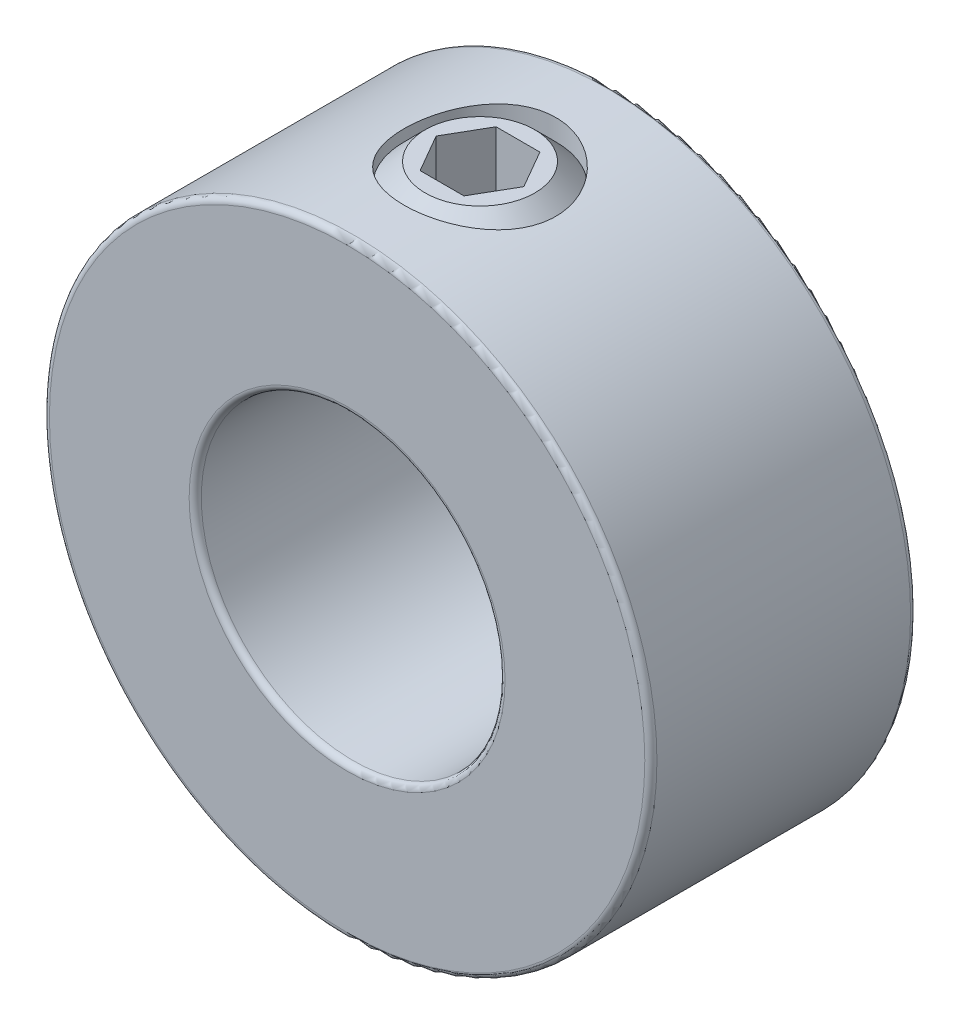
ISO-10303-21;
HEADER;
FILE_DESCRIPTION(('STEP AP214'),'2;1');
FILE_NAME('part.step','',(''),(''),'','','');
FILE_SCHEMA(('AUTOMOTIVE_DESIGN { 1 0 10303 214 1 1 1 1 }'));
ENDSEC;
DATA;
#1=APPLICATION_CONTEXT('core data for automotive mechanical design processes');
#2=APPLICATION_PROTOCOL_DEFINITION('international standard','automotive_design',2000,#1);
#3=PRODUCT_CONTEXT('',#1,'mechanical');
#4=PRODUCT('Part','Part','',(#3));
#5=PRODUCT_RELATED_PRODUCT_CATEGORY('part','',(#4));
#6=PRODUCT_DEFINITION_FORMATION('','',#4);
#7=PRODUCT_DEFINITION_CONTEXT('part definition',#1,'design');
#8=PRODUCT_DEFINITION('design','',#6,#7);
#9=PRODUCT_DEFINITION_SHAPE('','',#8);
#10=(LENGTH_UNIT() NAMED_UNIT(*) SI_UNIT(.MILLI.,.METRE.));
#11=(NAMED_UNIT(*) PLANE_ANGLE_UNIT() SI_UNIT($,.RADIAN.));
#12=(NAMED_UNIT(*) SI_UNIT($,.STERADIAN.) SOLID_ANGLE_UNIT());
#13=UNCERTAINTY_MEASURE_WITH_UNIT(LENGTH_MEASURE(1.E-05),#10,'distance_accuracy_value','');
#14=(GEOMETRIC_REPRESENTATION_CONTEXT(3) GLOBAL_UNCERTAINTY_ASSIGNED_CONTEXT((#13)) GLOBAL_UNIT_ASSIGNED_CONTEXT((#10,
#11,#12)) REPRESENTATION_CONTEXT('',''));
#15=CARTESIAN_POINT('',(0.,0.,0.));
#16=DIRECTION('',(0.,0.,1.));
#17=DIRECTION('',(1.,0.,0.));
#18=AXIS2_PLACEMENT_3D('',#15,#16,#17);
#19=CARTESIAN_POINT('',(0.,7.23364111915365,5.55625));
#20=DIRECTION('',(0.,1.,0.));
#21=DIRECTION('',(-1.,0.,0.));
#22=AXIS2_PLACEMENT_3D('',#19,#20,#21);
#23=CONICAL_SURFACE('',#22,3.175,0.785398163397439);
#24=CARTESIAN_POINT('',(0.,6.35,5.55625));
#25=DIRECTION('',(0.,-1.,0.));
#26=DIRECTION('',(1.,0.,0.));
#27=AXIS2_PLACEMENT_3D('',#24,#25,#26);
#28=CIRCLE('',#27,2.29135888084637);
#29=CARTESIAN_POINT('',(2.29135888084637,6.35,5.55625));
#30=VERTEX_POINT('',#29);
#31=EDGE_CURVE('E12',#30,#30,#28,.T.);
#32=ORIENTED_EDGE('',*,*,#31,.F.);
#33=EDGE_LOOP('',(#32));
#34=FACE_BOUND('',#33,.T.);
#35=CARTESIAN_POINT('',(0.,7.23364111915365,5.55625));
#36=DIRECTION('',(0.,-1.,0.));
#37=DIRECTION('',(1.,0.,0.));
#38=AXIS2_PLACEMENT_3D('',#35,#36,#37);
#39=CIRCLE('',#38,3.175);
#40=CARTESIAN_POINT('',(3.175,7.23364111915365,5.55625));
#41=VERTEX_POINT('',#40);
#42=EDGE_CURVE('E141',#41,#41,#39,.T.);
#43=ORIENTED_EDGE('',*,*,#42,.T.);
#44=EDGE_LOOP('',(#43));
#45=FACE_BOUND('',#44,.T.);
#46=ADVANCED_FACE('F42',(#34,#45),#23,.T.);
#47=CARTESIAN_POINT('',(-0.79375,6.35,5.55625));
#48=DIRECTION('',(0.,1.,0.));
#49=DIRECTION('',(-1.,0.,0.));
#50=AXIS2_PLACEMENT_3D('',#47,#48,#49);
#51=PLANE('',#50);
#52=CARTESIAN_POINT('',(0.,6.35,5.55625));
#53=DIRECTION('',(0.,-1.,0.));
#54=DIRECTION('',(1.,0.,0.));
#55=AXIS2_PLACEMENT_3D('',#52,#53,#54);
#56=CIRCLE('',#55,0.79375);
#57=CARTESIAN_POINT('',(0.79375,6.35,5.55625));
#58=VERTEX_POINT('',#57);
#59=EDGE_CURVE('E49',#58,#58,#56,.T.);
#60=ORIENTED_EDGE('',*,*,#59,.F.);
#61=EDGE_LOOP('',(#60));
#62=FACE_BOUND('',#61,.T.);
#63=ORIENTED_EDGE('',*,*,#31,.T.);
#64=EDGE_LOOP('',(#63));
#65=FACE_BOUND('',#64,.T.);
#66=ADVANCED_FACE('F161',(#62,#65),#51,.F.);
#67=CARTESIAN_POINT('',(0.,6.35,5.55625));
#68=DIRECTION('',(0.,-1.,0.));
#69=DIRECTION('',(1.,0.,0.));
#70=AXIS2_PLACEMENT_3D('',#67,#68,#69);
#71=CONICAL_SURFACE('',#70,0.79375,0.523598775598296);
#72=CARTESIAN_POINT('',(0.,7.72481532850781,5.55625));
#73=VERTEX_POINT('',#72);
#74=VERTEX_LOOP('',#73);
#75=FACE_BOUND('',#74,.T.);
#76=ORIENTED_EDGE('',*,*,#59,.T.);
#77=EDGE_LOOP('',(#76));
#78=FACE_BOUND('',#77,.T.);
#79=ADVANCED_FACE('F159',(#75,#78),#71,.F.);
#80=CARTESIAN_POINT('',(0.,12.7,5.55625));
#81=DIRECTION('',(0.,-1.,0.));
#82=DIRECTION('',(1.,0.,0.));
#83=AXIS2_PLACEMENT_3D('',#80,#81,#82);
#84=PLANE('',#83);
#85=DIRECTION('',(0.5,0.,0.866025403784438));
#86=VECTOR('',#85,1.);
#87=CARTESIAN_POINT('',(-1.83308710467713,12.7,5.55625000000001));
#88=LINE('',#87,#86);
#89=CARTESIAN_POINT('',(-1.83308710467713,12.7,5.55625000000001));
#90=VERTEX_POINT('',#89);
#91=CARTESIAN_POINT('',(-0.916543552338603,12.7,7.14375));
#92=VERTEX_POINT('',#91);
#93=EDGE_CURVE('E129',#90,#92,#88,.T.);
#94=ORIENTED_EDGE('',*,*,#93,.F.);
#95=DIRECTION('',(-0.499999999999999,0.,0.866025403784439));
#96=VECTOR('',#95,1.);
#97=CARTESIAN_POINT('',(-0.916543552338605,12.7,3.96875));
#98=LINE('',#97,#96);
#99=CARTESIAN_POINT('',(-0.916543552338605,12.7,3.96875));
#100=VERTEX_POINT('',#99);
#101=EDGE_CURVE('E56',#100,#90,#98,.T.);
#102=ORIENTED_EDGE('',*,*,#101,.F.);
#103=DIRECTION('',(-1.,0.,0.));
#104=VECTOR('',#103,1.);
#105=CARTESIAN_POINT('',(0.916543552338457,12.7,3.96875));
#106=LINE('',#105,#104);
#107=CARTESIAN_POINT('',(0.916543552338457,12.7,3.96875));
#108=VERTEX_POINT('',#107);
#109=EDGE_CURVE('E115',#108,#100,#106,.T.);
#110=ORIENTED_EDGE('',*,*,#109,.F.);
#111=DIRECTION('',(-0.5,0.,-0.866025403784438));
#112=VECTOR('',#111,1.);
#113=CARTESIAN_POINT('',(1.83308710467699,12.7,5.55625));
#114=LINE('',#113,#112);
#115=CARTESIAN_POINT('',(1.83308710467699,12.7,5.55625));
#116=VERTEX_POINT('',#115);
#117=EDGE_CURVE('E118',#116,#108,#114,.T.);
#118=ORIENTED_EDGE('',*,*,#117,.F.);
#119=DIRECTION('',(0.499999999999999,0.,-0.866025403784439));
#120=VECTOR('',#119,1.);
#121=CARTESIAN_POINT('',(0.916543552338459,12.7,7.14375));
#122=LINE('',#121,#120);
#123=CARTESIAN_POINT('',(0.916543552338459,12.7,7.14375));
#124=VERTEX_POINT('',#123);
#125=EDGE_CURVE('E134',#124,#116,#122,.T.);
#126=ORIENTED_EDGE('',*,*,#125,.F.);
#127=DIRECTION('',(1.,0.,0.));
#128=VECTOR('',#127,1.);
#129=CARTESIAN_POINT('',(-0.916543552338603,12.7,7.14375));
#130=LINE('',#129,#128);
#131=EDGE_CURVE('E131',#92,#124,#130,.T.);
#132=ORIENTED_EDGE('',*,*,#131,.F.);
#133=EDGE_LOOP('',(#94,#102,#110,#118,#126,#132));
#134=FACE_BOUND('',#133,.T.);
#135=CARTESIAN_POINT('',(0.,12.7,5.55625));
#136=DIRECTION('',(0.,-1.,0.));
#137=DIRECTION('',(1.,0.,0.));
#138=AXIS2_PLACEMENT_3D('',#135,#136,#137);
#139=CIRCLE('',#138,2.29135888084637);
#140=CARTESIAN_POINT('',(2.29135888084637,12.7,5.55625));
#141=VERTEX_POINT('',#140);
#142=EDGE_CURVE('E154',#141,#141,#139,.T.);
#143=ORIENTED_EDGE('',*,*,#142,.F.);
#144=EDGE_LOOP('',(#143));
#145=FACE_BOUND('',#144,.T.);
#146=ADVANCED_FACE('F179',(#134,#145),#84,.F.);
#147=CARTESIAN_POINT('',(0.,12.7,5.55625));
#148=DIRECTION('',(0.,-1.,0.));
#149=DIRECTION('',(1.,0.,0.));
#150=AXIS2_PLACEMENT_3D('',#147,#148,#149);
#151=CONICAL_SURFACE('',#150,2.29135888084637,0.785398163397431);
#152=CARTESIAN_POINT('',(0.,11.8163588808463,5.55625));
#153=DIRECTION('',(0.,-1.,0.));
#154=DIRECTION('',(1.,0.,0.));
#155=AXIS2_PLACEMENT_3D('',#152,#153,#154);
#156=CIRCLE('',#155,3.175);
#157=CARTESIAN_POINT('',(3.175,11.8163588808463,5.55625));
#158=VERTEX_POINT('',#157);
#159=EDGE_CURVE('E151',#158,#158,#156,.T.);
#160=ORIENTED_EDGE('',*,*,#159,.F.);
#161=EDGE_LOOP('',(#160));
#162=FACE_BOUND('',#161,.T.);
#163=ORIENTED_EDGE('',*,*,#142,.T.);
#164=EDGE_LOOP('',(#163));
#165=FACE_BOUND('',#164,.T.);
#166=ADVANCED_FACE('F173',(#162,#165),#151,.T.);
#167=CARTESIAN_POINT('',(0.,7.72481532850781,5.55625));
#168=DIRECTION('',(0.,-1.,0.));
#169=DIRECTION('',(1.,0.,0.));
#170=AXIS2_PLACEMENT_3D('',#167,#168,#169);
#171=CYLINDRICAL_SURFACE('',#170,3.175);
#172=ORIENTED_EDGE('',*,*,#42,.F.);
#173=EDGE_LOOP('',(#172));
#174=FACE_BOUND('',#173,.T.);
#175=ORIENTED_EDGE('',*,*,#159,.T.);
#176=EDGE_LOOP('',(#175));
#177=FACE_BOUND('',#176,.T.);
#178=ADVANCED_FACE('F170',(#174,#177),#171,.T.);
#179=CARTESIAN_POINT('',(-0.916543552338604,10.16,3.96875));
#180=DIRECTION('',(-0.866025403784439,0.,-0.499999999999999));
#181=DIRECTION('',(-0.499999999999999,0.,0.866025403784439));
#182=AXIS2_PLACEMENT_3D('',#179,#180,#181);
#183=PLANE('',#182);
#184=ORIENTED_EDGE('',*,*,#101,.T.);
#185=DIRECTION('',(0.,1.,0.));
#186=VECTOR('',#185,1.);
#187=CARTESIAN_POINT('',(-1.83308710467713,10.16,5.55625000000001));
#188=LINE('',#187,#186);
#189=CARTESIAN_POINT('',(-1.83308710467713,10.16,5.55625000000001));
#190=VERTEX_POINT('',#189);
#191=EDGE_CURVE('E92',#190,#90,#188,.T.);
#192=ORIENTED_EDGE('',*,*,#191,.F.);
#193=DIRECTION('',(-0.499999999999999,0.,0.866025403784439));
#194=VECTOR('',#193,1.);
#195=CARTESIAN_POINT('',(-0.916543552338604,10.16,3.96875));
#196=LINE('',#195,#194);
#197=CARTESIAN_POINT('',(-0.916543552338604,10.16,3.96875));
#198=VERTEX_POINT('',#197);
#199=EDGE_CURVE('E96',#198,#190,#196,.T.);
#200=ORIENTED_EDGE('',*,*,#199,.F.);
#201=DIRECTION('',(0.,1.,0.));
#202=VECTOR('',#201,1.);
#203=CARTESIAN_POINT('',(-0.916543552338604,10.16,3.96875));
#204=LINE('',#203,#202);
#205=EDGE_CURVE('E139',#198,#100,#204,.T.);
#206=ORIENTED_EDGE('',*,*,#205,.T.);
#207=EDGE_LOOP('',(#184,#192,#200,#206));
#208=FACE_BOUND('',#207,.T.);
#209=ADVANCED_FACE('F94',(#208),#183,.F.);
#210=CARTESIAN_POINT('',(0.916543552338458,10.16,3.96875));
#211=DIRECTION('',(0.,0.,-1.));
#212=DIRECTION('',(-1.,0.,0.));
#213=AXIS2_PLACEMENT_3D('',#210,#211,#212);
#214=PLANE('',#213);
#215=ORIENTED_EDGE('',*,*,#109,.T.);
#216=ORIENTED_EDGE('',*,*,#205,.F.);
#217=DIRECTION('',(-1.,0.,0.));
#218=VECTOR('',#217,1.);
#219=CARTESIAN_POINT('',(0.916543552338458,10.16,3.96875));
#220=LINE('',#219,#218);
#221=CARTESIAN_POINT('',(0.916543552338458,10.16,3.96875));
#222=VERTEX_POINT('',#221);
#223=EDGE_CURVE('E102',#222,#198,#220,.T.);
#224=ORIENTED_EDGE('',*,*,#223,.F.);
#225=DIRECTION('',(0.,1.,0.));
#226=VECTOR('',#225,1.);
#227=CARTESIAN_POINT('',(0.916543552338458,10.16,3.96875));
#228=LINE('',#227,#226);
#229=EDGE_CURVE('E142',#222,#108,#228,.T.);
#230=ORIENTED_EDGE('',*,*,#229,.T.);
#231=EDGE_LOOP('',(#215,#216,#224,#230));
#232=FACE_BOUND('',#231,.T.);
#233=ADVANCED_FACE('F193',(#232),#214,.F.);
#234=CARTESIAN_POINT('',(1.83308710467699,10.16,5.55625));
#235=DIRECTION('',(0.866025403784438,0.,-0.5));
#236=DIRECTION('',(-0.5,0.,-0.866025403784438));
#237=AXIS2_PLACEMENT_3D('',#234,#235,#236);
#238=PLANE('',#237);
#239=ORIENTED_EDGE('',*,*,#117,.T.);
#240=ORIENTED_EDGE('',*,*,#229,.F.);
#241=DIRECTION('',(-0.5,0.,-0.866025403784438));
#242=VECTOR('',#241,1.);
#243=CARTESIAN_POINT('',(1.83308710467699,10.16,5.55625));
#244=LINE('',#243,#242);
#245=CARTESIAN_POINT('',(1.83308710467699,10.16,5.55625));
#246=VERTEX_POINT('',#245);
#247=EDGE_CURVE('E125',#246,#222,#244,.T.);
#248=ORIENTED_EDGE('',*,*,#247,.F.);
#249=DIRECTION('',(0.,1.,0.));
#250=VECTOR('',#249,1.);
#251=CARTESIAN_POINT('',(1.83308710467699,10.16,5.55625));
#252=LINE('',#251,#250);
#253=EDGE_CURVE('E144',#246,#116,#252,.T.);
#254=ORIENTED_EDGE('',*,*,#253,.T.);
#255=EDGE_LOOP('',(#239,#240,#248,#254));
#256=FACE_BOUND('',#255,.T.);
#257=ADVANCED_FACE('F203',(#256),#238,.F.);
#258=CARTESIAN_POINT('',(0.916543552338459,10.16,7.14375));
#259=DIRECTION('',(0.866025403784439,0.,0.499999999999999));
#260=DIRECTION('',(0.499999999999999,0.,-0.866025403784439));
#261=AXIS2_PLACEMENT_3D('',#258,#259,#260);
#262=PLANE('',#261);
#263=ORIENTED_EDGE('',*,*,#125,.T.);
#264=ORIENTED_EDGE('',*,*,#253,.F.);
#265=DIRECTION('',(0.499999999999999,0.,-0.866025403784439));
#266=VECTOR('',#265,1.);
#267=CARTESIAN_POINT('',(0.916543552338459,10.16,7.14375));
#268=LINE('',#267,#266);
#269=CARTESIAN_POINT('',(0.916543552338459,10.16,7.14375));
#270=VERTEX_POINT('',#269);
#271=EDGE_CURVE('E122',#270,#246,#268,.T.);
#272=ORIENTED_EDGE('',*,*,#271,.F.);
#273=DIRECTION('',(0.,1.,0.));
#274=VECTOR('',#273,1.);
#275=CARTESIAN_POINT('',(0.916543552338459,10.16,7.14375));
#276=LINE('',#275,#274);
#277=EDGE_CURVE('E146',#270,#124,#276,.T.);
#278=ORIENTED_EDGE('',*,*,#277,.T.);
#279=EDGE_LOOP('',(#263,#264,#272,#278));
#280=FACE_BOUND('',#279,.T.);
#281=ADVANCED_FACE('F199',(#280),#262,.F.);
#282=CARTESIAN_POINT('',(-0.916543552338603,10.16,7.14375));
#283=DIRECTION('',(0.,0.,1.));
#284=DIRECTION('',(1.,0.,0.));
#285=AXIS2_PLACEMENT_3D('',#282,#283,#284);
#286=PLANE('',#285);
#287=ORIENTED_EDGE('',*,*,#131,.T.);
#288=ORIENTED_EDGE('',*,*,#277,.F.);
#289=DIRECTION('',(1.,0.,0.));
#290=VECTOR('',#289,1.);
#291=CARTESIAN_POINT('',(-0.916543552338603,10.16,7.14375));
#292=LINE('',#291,#290);
#293=CARTESIAN_POINT('',(-0.916543552338603,10.16,7.14375));
#294=VERTEX_POINT('',#293);
#295=EDGE_CURVE('E110',#294,#270,#292,.T.);
#296=ORIENTED_EDGE('',*,*,#295,.F.);
#297=DIRECTION('',(0.,1.,0.));
#298=VECTOR('',#297,1.);
#299=CARTESIAN_POINT('',(-0.916543552338603,10.16,7.14375));
#300=LINE('',#299,#298);
#301=EDGE_CURVE('E101',#294,#92,#300,.T.);
#302=ORIENTED_EDGE('',*,*,#301,.T.);
#303=EDGE_LOOP('',(#287,#288,#296,#302));
#304=FACE_BOUND('',#303,.T.);
#305=ADVANCED_FACE('F196',(#304),#286,.F.);
#306=CARTESIAN_POINT('',(-1.83308710467713,10.16,5.55625000000001));
#307=DIRECTION('',(-0.866025403784438,0.,0.5));
#308=DIRECTION('',(0.5,0.,0.866025403784439));
#309=AXIS2_PLACEMENT_3D('',#306,#307,#308);
#310=PLANE('',#309);
#311=ORIENTED_EDGE('',*,*,#93,.T.);
#312=ORIENTED_EDGE('',*,*,#301,.F.);
#313=DIRECTION('',(0.5,0.,0.866025403784438));
#314=VECTOR('',#313,1.);
#315=CARTESIAN_POINT('',(-1.83308710467713,10.16,5.55625000000001));
#316=LINE('',#315,#314);
#317=EDGE_CURVE('E105',#190,#294,#316,.T.);
#318=ORIENTED_EDGE('',*,*,#317,.F.);
#319=ORIENTED_EDGE('',*,*,#191,.T.);
#320=EDGE_LOOP('',(#311,#312,#318,#319));
#321=FACE_BOUND('',#320,.T.);
#322=ADVANCED_FACE('F106',(#321),#310,.F.);
#323=CARTESIAN_POINT('',(-2.74963065701566,10.16,7.14375));
#324=DIRECTION('',(0.,1.,0.));
#325=DIRECTION('',(0.,0.,1.));
#326=AXIS2_PLACEMENT_3D('',#323,#324,#325);
#327=PLANE('',#326);
#328=ORIENTED_EDGE('',*,*,#199,.T.);
#329=ORIENTED_EDGE('',*,*,#317,.T.);
#330=ORIENTED_EDGE('',*,*,#295,.T.);
#331=ORIENTED_EDGE('',*,*,#271,.T.);
#332=ORIENTED_EDGE('',*,*,#247,.T.);
#333=ORIENTED_EDGE('',*,*,#223,.T.);
#334=EDGE_LOOP('',(#328,#329,#330,#331,#332,#333));
#335=FACE_BOUND('',#334,.T.);
#336=ADVANCED_FACE('F112',(#335),#327,.T.);
#337=CLOSED_SHELL('',(#46,#66,#79,#146,#166,#178,#209,#233,#257,#281,#305,#322,#336));
#338=MANIFOLD_SOLID_BREP('B2',#337);
#339=CARTESIAN_POINT('',(0.,0.,11.1125));
#340=DIRECTION('',(0.,0.,1.));
#341=DIRECTION('',(1.,0.,0.));
#342=AXIS2_PLACEMENT_3D('',#339,#340,#341);
#343=PLANE('',#342);
#344=CARTESIAN_POINT('',(0.,0.,11.1125));
#345=DIRECTION('',(0.,0.,1.));
#346=DIRECTION('',(1.,0.,0.));
#347=AXIS2_PLACEMENT_3D('',#344,#345,#346);
#348=CIRCLE('',#347,6.604);
#349=CARTESIAN_POINT('',(6.604,0.,11.1125));
#350=VERTEX_POINT('',#349);
#351=EDGE_CURVE('E307',#350,#350,#348,.F.);
#352=ORIENTED_EDGE('',*,*,#351,.T.);
#353=EDGE_LOOP('',(#352));
#354=FACE_BOUND('',#353,.T.);
#355=CARTESIAN_POINT('',(0.,0.,11.1125));
#356=DIRECTION('',(0.,0.,1.));
#357=DIRECTION('',(1.,0.,0.));
#358=AXIS2_PLACEMENT_3D('',#355,#356,#357);
#359=CIRCLE('',#358,12.446);
#360=CARTESIAN_POINT('',(12.446,0.,11.1125));
#361=VERTEX_POINT('',#360);
#362=EDGE_CURVE('E311',#361,#361,#359,.T.);
#363=ORIENTED_EDGE('',*,*,#362,.T.);
#364=EDGE_LOOP('',(#363));
#365=FACE_BOUND('',#364,.T.);
#366=ADVANCED_FACE('F296',(#354,#365),#343,.T.);
#367=CARTESIAN_POINT('',(0.,0.,0.));
#368=DIRECTION('',(0.,0.,1.));
#369=DIRECTION('',(1.,0.,0.));
#370=AXIS2_PLACEMENT_3D('',#367,#368,#369);
#371=PLANE('',#370);
#372=CARTESIAN_POINT('',(0.,0.,0.));
#373=DIRECTION('',(0.,0.,1.));
#374=DIRECTION('',(1.,0.,0.));
#375=AXIS2_PLACEMENT_3D('',#372,#373,#374);
#376=CIRCLE('',#375,6.604);
#377=CARTESIAN_POINT('',(6.604,0.,0.));
#378=VERTEX_POINT('',#377);
#379=EDGE_CURVE('E322',#378,#378,#376,.T.);
#380=ORIENTED_EDGE('',*,*,#379,.T.);
#381=EDGE_LOOP('',(#380));
#382=FACE_BOUND('',#381,.T.);
#383=CARTESIAN_POINT('',(0.,0.,0.));
#384=DIRECTION('',(0.,0.,1.));
#385=DIRECTION('',(1.,0.,0.));
#386=AXIS2_PLACEMENT_3D('',#383,#384,#385);
#387=CIRCLE('',#386,12.446);
#388=CARTESIAN_POINT('',(12.446,0.,0.));
#389=VERTEX_POINT('',#388);
#390=EDGE_CURVE('E325',#389,#389,#387,.F.);
#391=ORIENTED_EDGE('',*,*,#390,.T.);
#392=EDGE_LOOP('',(#391));
#393=FACE_BOUND('',#392,.T.);
#394=ADVANCED_FACE('F359',(#382,#393),#371,.F.);
#395=CARTESIAN_POINT('',(0.,0.,11.1125));
#396=DIRECTION('',(0.,0.,-1.));
#397=DIRECTION('',(-1.,0.,0.));
#398=AXIS2_PLACEMENT_3D('',#395,#396,#397);
#399=CYLINDRICAL_SURFACE('',#398,12.7);
#400=CARTESIAN_POINT('',(0.,0.,0.254000000000001));
#401=DIRECTION('',(0.,0.,1.));
#402=DIRECTION('',(1.,0.,0.));
#403=AXIS2_PLACEMENT_3D('',#400,#401,#402);
#404=CIRCLE('',#403,12.7);
#405=CARTESIAN_POINT('',(12.7,0.,0.254000000000001));
#406=VERTEX_POINT('',#405);
#407=EDGE_CURVE('E41',#406,#406,#404,.T.);
#408=ORIENTED_EDGE('',*,*,#407,.T.);
#409=EDGE_LOOP('',(#408));
#410=FACE_BOUND('',#409,.T.);
#411=CARTESIAN_POINT('',(0.,0.,10.8585));
#412=DIRECTION('',(0.,0.,1.));
#413=DIRECTION('',(1.,0.,0.));
#414=AXIS2_PLACEMENT_3D('',#411,#412,#413);
#415=CIRCLE('',#414,12.7);
#416=CARTESIAN_POINT('',(12.7,0.,10.8585));
#417=VERTEX_POINT('',#416);
#418=EDGE_CURVE('E303',#417,#417,#415,.F.);
#419=ORIENTED_EDGE('',*,*,#418,.T.);
#420=EDGE_LOOP('',(#419));
#421=FACE_BOUND('',#420,.T.);
#422=CARTESIAN_POINT('',(0.,12.7,8.73125));
#423=CARTESIAN_POINT('',(-0.175421054350931,12.6999970338729,8.73124507718757));
#424=CARTESIAN_POINT('',(-0.350897100741782,12.6963292371237,8.71666288419548));
#425=CARTESIAN_POINT('',(-0.696820051980961,12.6820530760661,8.65880676306684));
#426=CARTESIAN_POINT('',(-0.867264049209732,12.6714407780562,8.61551657314489));
#427=CARTESIAN_POINT('',(-1.19807751278645,12.6444507573614,8.50172024683859));
#428=CARTESIAN_POINT('',(-1.35845880926017,12.6280799601569,8.43124679271935));
#429=CARTESIAN_POINT('',(-1.6651226791977,12.591316443928,8.26519939107175));
#430=CARTESIAN_POINT('',(-1.81140477687155,12.5709235892463,8.16962459688152));
#431=CARTESIAN_POINT('',(-2.08873074612027,12.5278602543575,7.95400832856532));
#432=CARTESIAN_POINT('',(-2.2194428772959,12.5051546346353,7.83354716633666));
#433=CARTESIAN_POINT('',(-2.45903522924703,12.4602582924963,7.57247616627588));
#434=CARTESIAN_POINT('',(-2.56791298487579,12.4380676284689,7.43186405642899));
#435=CARTESIAN_POINT('',(-2.76230618225783,12.3963594189446,7.13190677007337));
#436=CARTESIAN_POINT('',(-2.84745052370821,12.3768864828385,6.97231432812153));
#437=CARTESIAN_POINT('',(-2.98957345643241,12.343330973648,6.64051586198626));
#438=CARTESIAN_POINT('',(-3.04655655068163,12.3292475388652,6.46831185944724));
#439=CARTESIAN_POINT('',(-3.12960773790342,12.3084267567388,6.11982626213982));
#440=CARTESIAN_POINT('',(-3.15627230130285,12.3015478927701,5.94369547005292));
#441=CARTESIAN_POINT('',(-3.17978742389056,12.2954915053947,5.58933652895139));
#442=CARTESIAN_POINT('',(-3.176642833515,12.2963127290578,5.41110872586831));
#443=CARTESIAN_POINT('',(-3.14110481048737,12.3054365167726,5.06218654027234));
#444=CARTESIAN_POINT('',(-3.10942215340351,12.3135572669877,4.89141426789839));
#445=CARTESIAN_POINT('',(-3.01884119561133,12.3360753547043,4.55768910890493));
#446=CARTESIAN_POINT('',(-2.95994095604688,12.3504731393489,4.39473678025545));
#447=CARTESIAN_POINT('',(-2.81599106163371,12.3840899110031,4.079371198933));
#448=CARTESIAN_POINT('',(-2.73068344564301,12.4033560981111,3.92708093637875));
#449=CARTESIAN_POINT('',(-2.53652078423163,12.4445122129068,3.63872206434807));
#450=CARTESIAN_POINT('',(-2.42766161831204,12.4664025994163,3.50265629992432));
#451=CARTESIAN_POINT('',(-2.18580424890858,12.5111061380944,3.24653568011351));
#452=CARTESIAN_POINT('',(-2.05220624645107,12.533927803951,3.12704799603681));
#453=CARTESIAN_POINT('',(-1.76659522538283,12.5773596047503,2.91206503678474));
#454=CARTESIAN_POINT('',(-1.61458164448181,12.5979696721291,2.81657049447546));
#455=CARTESIAN_POINT('',(-1.29564529770894,12.6347586626604,2.65207625915839));
#456=CARTESIAN_POINT('',(-1.12867311562492,12.6509221227036,2.58316869646146));
#457=CARTESIAN_POINT('',(-0.785020883902434,12.676884242985,2.47455836958141));
#458=CARTESIAN_POINT('',(-0.608342698201858,12.6866841206814,2.43485001891495));
#459=CARTESIAN_POINT('',(-0.255142937325555,12.6986347345774,2.3866314862338));
#460=CARTESIAN_POINT('',(-0.0787330573083763,12.7009747992585,2.37734892814061));
#461=CARTESIAN_POINT('',(0.273119584996528,12.6982813685726,2.38812705435079));
#462=CARTESIAN_POINT('',(0.448562432914396,12.6932485369526,2.40818509725818));
#463=CARTESIAN_POINT('',(0.79081686891024,12.6764961338623,2.47643842276175));
#464=CARTESIAN_POINT('',(0.957717835150523,12.6648767569325,2.52421234102626));
#465=CARTESIAN_POINT('',(1.28112793569116,12.6362609570897,2.64605999452691));
#466=CARTESIAN_POINT('',(1.43763601861911,12.6192639911647,2.72013638579632));
#467=CARTESIAN_POINT('',(1.73889063454314,12.5813250177716,2.8939831394514));
#468=CARTESIAN_POINT('',(1.88337918521904,12.5603183592593,2.99418610457274));
#469=CARTESIAN_POINT('',(2.15376466554501,12.5167921111412,3.21688864028734));
#470=CARTESIAN_POINT('',(2.27965837982672,12.4942722608556,3.33939205885733));
#471=CARTESIAN_POINT('',(2.51246336908675,12.4495762556412,3.60680415045255));
#472=CARTESIAN_POINT('',(2.6188328531313,12.4274221051899,3.75218897134919));
#473=CARTESIAN_POINT('',(2.80566443991221,12.3865825924258,4.05920074295838));
#474=CARTESIAN_POINT('',(2.88612769264178,12.3678970761538,4.22082697228701));
#475=CARTESIAN_POINT('',(3.0182638402854,12.3363163381503,4.55486711242697));
#476=CARTESIAN_POINT('',(3.07010730622843,12.3233869021911,4.72721014659598));
#477=CARTESIAN_POINT('',(3.14398164687971,12.3047494152553,5.07853873345877));
#478=CARTESIAN_POINT('',(3.16601904149253,12.299039785006,5.25752282465607));
#479=CARTESIAN_POINT('',(3.17931501621074,12.2956087422145,5.61153950052041));
#480=CARTESIAN_POINT('',(3.17143955029538,12.2976625750886,5.7865379043875));
#481=CARTESIAN_POINT('',(3.1271152390873,12.3090074061494,6.13262656437627));
#482=CARTESIAN_POINT('',(3.09066696801937,12.3182982588945,6.30371689896691));
#483=CARTESIAN_POINT('',(2.9907046261569,12.3429450180984,6.63619123834369));
#484=CARTESIAN_POINT('',(2.92735297324093,12.3582644892528,6.79762696275538));
#485=CARTESIAN_POINT('',(2.7755107337966,12.3932474960913,7.10769339341372));
#486=CARTESIAN_POINT('',(2.68701666057215,12.4129116342002,7.25632231991314));
#487=CARTESIAN_POINT('',(2.48468673461549,12.4550092586011,7.54074063138676));
#488=CARTESIAN_POINT('',(2.37025002816433,12.4775016056118,7.67609393874716));
#489=CARTESIAN_POINT('',(2.12045416901821,12.5223699100401,7.92595791148385));
#490=CARTESIAN_POINT('',(1.98509005500274,12.5447458385544,8.04046362040585));
#491=CARTESIAN_POINT('',(1.6943230585205,12.5873437112106,8.24740393646169));
#492=CARTESIAN_POINT('',(1.53860166056969,12.6075193062447,8.33940126560483));
#493=CARTESIAN_POINT('',(1.21341315929717,12.6429542453062,8.49576546322414));
#494=CARTESIAN_POINT('',(1.04395600927443,12.6582171100619,8.56015213003941));
#495=CARTESIAN_POINT('',(0.729001702698681,12.6798505941374,8.64991037419776));
#496=CARTESIAN_POINT('',(0.585004695088744,12.6873547169486,8.68034679779644));
#497=CARTESIAN_POINT('',(0.294017851418466,12.6974304774096,8.72101791399978));
#498=CARTESIAN_POINT('',(0.147028241296871,12.7000024860439,8.73125412602956));
#499=CARTESIAN_POINT('',(0.,12.7,8.73125));
#500=B_SPLINE_CURVE_WITH_KNOTS('',3,(#422,#423,#424,#425,#426,#427,#428,#429,#430,#431,#432,
#433,#434,#435,#436,#437,#438,#439,#440,#441,#442,#443,#444,#445,#446,#447,#448,#449,#450,#451,
#452,#453,#454,#455,#456,#457,#458,#459,#460,#461,#462,#463,#464,#465,#466,#467,#468,#469,#470,
#471,#472,#473,#474,#475,#476,#477,#478,#479,#480,#481,#482,#483,#484,#485,#486,#487,#488,#489,
#490,#491,#492,#493,#494,#495,#496,#497,#498,#499),.UNSPECIFIED.,.T.,.F.,(4,2,2,2,2,2,2,2,2,2,2,
2,2,2,2,2,2,2,2,2,2,2,2,2,2,2,2,2,2,2,2,2,2,2,2,2,2,2,4),(0.,0.5257243580655,1.05174676993359,
1.57713870983892,2.10254837335841,2.63767221675278,3.17285644277798,3.71599137305291,
4.25903942808497,4.79120824630598,5.32329047345571,5.84247618671884,6.36169889010144,
6.8861628400674,7.41071862276906,7.9502317705812,8.48976139571985,9.0311441807632,
9.57242335981323,10.09985087283,10.6272309069567,11.1467958106174,11.6664131950588,
12.1952509368702,12.7241800170734,13.266092111565,13.8079801469349,14.34660272276,
14.8851074589671,15.4081433519175,15.9311687337377,16.4510804786766,16.9710643590661,
17.5046127008448,18.0382877269755,18.5816279265763,19.1245778677202,19.5652441424438,
20.005877269746),.UNSPECIFIED.);
#501=CARTESIAN_POINT('',(0.,12.7,8.73125));
#502=VERTEX_POINT('',#501);
#503=EDGE_CURVE('E328',#502,#502,#500,.T.);
#504=ORIENTED_EDGE('',*,*,#503,.T.);
#505=EDGE_LOOP('',(#504));
#506=FACE_BOUND('',#505,.T.);
#507=ADVANCED_FACE('F355',(#410,#421,#506),#399,.T.);
#508=CARTESIAN_POINT('',(0.,0.,11.1125));
#509=DIRECTION('',(0.,0.,-1.));
#510=DIRECTION('',(-1.,0.,0.));
#511=AXIS2_PLACEMENT_3D('',#508,#509,#510);
#512=CYLINDRICAL_SURFACE('',#511,6.35);
#513=CARTESIAN_POINT('',(0.,0.,0.254000000000001));
#514=DIRECTION('',(0.,0.,1.));
#515=DIRECTION('',(1.,0.,0.));
#516=AXIS2_PLACEMENT_3D('',#513,#514,#515);
#517=CIRCLE('',#516,6.35);
#518=CARTESIAN_POINT('',(6.35,0.,0.254000000000001));
#519=VERTEX_POINT('',#518);
#520=EDGE_CURVE('E316',#519,#519,#517,.F.);
#521=ORIENTED_EDGE('',*,*,#520,.T.);
#522=EDGE_LOOP('',(#521));
#523=FACE_BOUND('',#522,.T.);
#524=CARTESIAN_POINT('',(0.,0.,10.8585));
#525=DIRECTION('',(0.,0.,1.));
#526=DIRECTION('',(1.,0.,0.));
#527=AXIS2_PLACEMENT_3D('',#524,#525,#526);
#528=CIRCLE('',#527,6.35);
#529=CARTESIAN_POINT('',(6.35,0.,10.8585));
#530=VERTEX_POINT('',#529);
#531=EDGE_CURVE('E319',#530,#530,#528,.T.);
#532=ORIENTED_EDGE('',*,*,#531,.T.);
#533=EDGE_LOOP('',(#532));
#534=FACE_BOUND('',#533,.T.);
#535=CARTESIAN_POINT('',(0.,6.35,8.73125));
#536=CARTESIAN_POINT('',(-0.0834969220594999,6.34999931166444,8.73124911228237));
#537=CARTESIAN_POINT('',(-0.167002655580042,6.34834758911701,8.72795012555405));
#538=CARTESIAN_POINT('',(-0.333378330258782,6.34179105821715,8.71480412545011));
#539=CARTESIAN_POINT('',(-0.416247978955772,6.33688483467113,8.70495426347423));
#540=CARTESIAN_POINT('',(-0.66318203064701,6.31742426748325,8.66567793495399));
#541=CARTESIAN_POINT('',(-0.825450146761554,6.29812827299425,8.62652492259861));
#542=CARTESIAN_POINT('',(-1.13965128900426,6.24891823135741,8.52425928870585));
#543=CARTESIAN_POINT('',(-1.29162180811869,6.21904547786825,8.4612397807566));
#544=CARTESIAN_POINT('',(-1.58264035037879,6.15142812041638,8.31351392637111));
#545=CARTESIAN_POINT('',(-1.72168939123018,6.11368413715877,8.22880928984904));
#546=CARTESIAN_POINT('',(-1.99234108848171,6.03111096182982,8.03428037026578));
#547=CARTESIAN_POINT('',(-2.12298433900092,5.98599127270818,7.92324642220607));
#548=CARTESIAN_POINT('',(-2.36467069069854,5.89470535591056,7.68185331642722));
#549=CARTESIAN_POINT('',(-2.47569885601321,5.84853836069043,7.55147957023356));
#550=CARTESIAN_POINT('',(-2.68368848497886,5.75623634934465,7.26282905224669));
#551=CARTESIAN_POINT('',(-2.77889135161934,5.71038146176788,7.10317246869842));
#552=CARTESIAN_POINT('',(-2.90019349951534,5.64919759286363,6.85170201282557));
#553=CARTESIAN_POINT('',(-2.93705266116892,5.63006420805933,6.76584993817133));
#554=CARTESIAN_POINT('',(-3.00322508739606,5.59504604853268,6.59066438629358));
#555=CARTESIAN_POINT('',(-3.03254280972159,5.57915935583429,6.50133300181945));
#556=CARTESIAN_POINT('',(-3.08174263292982,5.55212611635049,6.32523944803526));
#557=CARTESIAN_POINT('',(-3.10208128111978,5.54075429137746,6.23863920597144));
#558=CARTESIAN_POINT('',(-3.13545600360765,5.52193654886444,6.0636627210056));
#559=CARTESIAN_POINT('',(-3.14849595237257,5.51448854851135,5.9752874462283));
#560=CARTESIAN_POINT('',(-3.1670771305344,5.50383875782919,5.79754326115139));
#561=CARTESIAN_POINT('',(-3.1726228759965,5.50063441026522,5.7081749820126));
#562=CARTESIAN_POINT('',(-3.17614778806993,5.49859788398609,5.52926921582192));
#563=CARTESIAN_POINT('',(-3.17412767659872,5.49976528812799,5.43973174572866));
#564=CARTESIAN_POINT('',(-3.1581193033026,5.50899190362733,5.1935021242756));
#565=CARTESIAN_POINT('',(-3.13621253452965,5.52160857357707,5.03740827018664));
#566=CARTESIAN_POINT('',(-3.07003746372168,5.55866493052825,4.73160335869347));
#567=CARTESIAN_POINT('',(-3.02576203854504,5.58310838358077,4.58189435097724));
#568=CARTESIAN_POINT('',(-2.91531509833647,5.64157885407237,4.28870570343586));
#569=CARTESIAN_POINT('',(-2.84865758129418,5.67581583876129,4.14545239006338));
#570=CARTESIAN_POINT('',(-2.69570761526054,5.75003268807633,3.87148391382598));
#571=CARTESIAN_POINT('',(-2.60940634674629,5.79001512927804,3.7407744203915));
#572=CARTESIAN_POINT('',(-2.40685964249565,5.87734289018611,3.47814572574971));
#573=CARTESIAN_POINT('',(-2.28820488335253,5.92497898403936,3.3481746151435));
#574=CARTESIAN_POINT('',(-2.03058898448427,6.01813700574905,3.10916485713616));
#575=CARTESIAN_POINT('',(-1.89161819563546,6.06365791538158,3.00013621364131));
#576=CARTESIAN_POINT('',(-1.58913989972483,6.1500381059768,2.80134808028029));
#577=CARTESIAN_POINT('',(-1.42479265164789,6.19058274974572,2.71271851442006));
#578=CARTESIAN_POINT('',(-1.08098023585583,6.25976272299952,2.56509191836466));
#579=CARTESIAN_POINT('',(-0.901527205073896,6.28840750578946,2.50607135886829));
#580=CARTESIAN_POINT('',(-0.548533610626834,6.32854759690358,2.42419059660096));
#581=CARTESIAN_POINT('',(-0.375734359385244,6.34126679122996,2.39874032741267));
#582=CARTESIAN_POINT('',(-0.027875229944831,6.35231817716325,2.37659947773974));
#583=CARTESIAN_POINT('',(0.14718353806002,6.3506571843613,2.37989527286068));
#584=CARTESIAN_POINT('',(0.480164686080363,6.33384535408399,2.41365623594539));
#585=CARTESIAN_POINT('',(0.638363620564191,6.31975005060431,2.44199579147485));
#586=CARTESIAN_POINT('',(0.947441883053002,6.28085393924121,2.5217058782099));
#587=CARTESIAN_POINT('',(1.09832040207141,6.25605195113515,2.57307894847729));
#588=CARTESIAN_POINT('',(1.39347133182512,6.19709998236334,2.6987451309378));
#589=CARTESIAN_POINT('',(1.53743151047822,6.16270299610718,2.7736515841112));
#590=CARTESIAN_POINT('',(1.8112148234104,6.08787118465665,2.94356642568588));
#591=CARTESIAN_POINT('',(1.94103189959928,6.0474337895468,3.03858337738541));
#592=CARTESIAN_POINT('',(2.19636241342679,5.95973602709939,3.25678935037378));
#593=CARTESIAN_POINT('',(2.3202013468198,5.91219559251098,3.38182860711157));
#594=CARTESIAN_POINT('',(2.54589381918874,5.81858093231368,3.65101235514976));
#595=CARTESIAN_POINT('',(2.64773214935251,5.77250773963547,3.79516995238094));
#596=CARTESIAN_POINT('',(2.83117262876716,5.68487535288742,4.10731860195836));
#597=CARTESIAN_POINT('',(2.91155594998014,5.64364281441821,4.27612576951039));
#598=CARTESIAN_POINT('',(3.04191297152939,5.5744767953732,4.62759446488968));
#599=CARTESIAN_POINT('',(3.0919258549222,5.54652618900869,4.81023779784739));
#600=CARTESIAN_POINT('',(3.15551086037918,5.51057765714603,5.16543995647017));
#601=CARTESIAN_POINT('',(3.17212027309711,5.50092192343245,5.33728375040722));
#602=CARTESIAN_POINT('',(3.17718805563876,5.49800001145358,5.68149444249521));
#603=CARTESIAN_POINT('',(3.16565862768386,5.50472672904441,5.85386108154264));
#604=CARTESIAN_POINT('',(3.11761548073658,5.53205211477784,6.17691010307392));
#605=CARTESIAN_POINT('',(3.08358651207686,5.5512682307627,6.32809394173115));
#606=CARTESIAN_POINT('',(2.99458164828807,5.59977978302582,6.62244083016718));
#607=CARTESIAN_POINT('',(2.93959901505999,5.62907846127335,6.7656012828503));
#608=CARTESIAN_POINT('',(2.8061154442137,5.69685576337175,7.05048369942855));
#609=CARTESIAN_POINT('',(2.72628260503929,5.73581889480533,7.19146280936567));
#610=CARTESIAN_POINT('',(2.54682759156583,5.81772207082382,7.4589474317231));
#611=CARTESIAN_POINT('',(2.44719512169931,5.86066417820131,7.58544535994271));
#612=CARTESIAN_POINT('',(2.21680287661219,5.95192753761204,7.83634752417706));
#613=CARTESIAN_POINT('',(2.08373188558712,6.00026839877347,7.9586297564128));
#614=CARTESIAN_POINT('',(1.79751265125243,6.0921234557675,8.17964787323312));
#615=CARTESIAN_POINT('',(1.64435365457428,6.13563504323043,8.27837106598272));
#616=CARTESIAN_POINT('',(1.40178715704487,6.19391073190243,8.40653026619707));
#617=CARTESIAN_POINT('',(1.31842200030918,6.21223173271384,8.4460505836814));
#618=CARTESIAN_POINT('',(1.1480770102167,6.24595363475604,8.5178494748237));
#619=CARTESIAN_POINT('',(1.06109897786306,6.26135597012704,8.55013160653437));
#620=CARTESIAN_POINT('',(0.884361322813106,6.28875097111981,8.607009345915));
#621=CARTESIAN_POINT('',(0.794608244970571,6.30075106809478,8.63162171813812));
#622=CARTESIAN_POINT('',(0.612925661591582,6.32100983571903,8.67291738952989));
#623=CARTESIAN_POINT('',(0.52099752168029,6.3292707916836,8.68960553219355));
#624=CARTESIAN_POINT('',(0.357531347524375,6.34032503263334,8.71186628486239));
#625=CARTESIAN_POINT('',(0.286274046488597,6.34394670812889,8.71912882124964));
#626=CARTESIAN_POINT('',(0.143346668941348,6.34878452045567,8.72882112653757));
#627=CARTESIAN_POINT('',(0.0716765810914263,6.35000059089052,8.73125076204683));
#628=CARTESIAN_POINT('',(0.,6.35,8.73125));
#629=B_SPLINE_CURVE_WITH_KNOTS('',3,(#535,#536,#537,#538,#539,#540,#541,#542,#543,#544,#545,
#546,#547,#548,#549,#550,#551,#552,#553,#554,#555,#556,#557,#558,#559,#560,#561,#562,#563,#564,
#565,#566,#567,#568,#569,#570,#571,#572,#573,#574,#575,#576,#577,#578,#579,#580,#581,#582,#583,
#584,#585,#586,#587,#588,#589,#590,#591,#592,#593,#594,#595,#596,#597,#598,#599,#600,#601,#602,
#603,#604,#605,#606,#607,#608,#609,#610,#611,#612,#613,#614,#615,#616,#617,#618,#619,#620,#621,
#622,#623,#624,#625,#626,#627,#628),.UNSPECIFIED.,.T.,.F.,(4,2,2,2,2,2,2,2,2,2,2,2,2,2,2,2,2,2,
2,2,2,2,2,2,2,2,2,2,2,2,2,2,2,2,2,2,2,2,2,2,2,2,2,2,2,2,4),(0.,0.25041561210268,
0.500940186864014,1.00234854488129,1.50182051324263,2.00125310940106,2.53090025348452,
3.06094897410615,3.63210298373098,3.91787290005989,4.2034735073285,4.47213270490103,
4.74064915090148,5.00900371453887,5.27733267302577,5.74927594687739,6.22136960256846,
6.70445970327764,7.18776712794021,7.73235646527881,8.27720530143646,8.84735553323666,
9.41705196489304,9.93956405039339,10.4618285011675,10.9436138594975,11.4254523397102,
11.921067756814,12.4168946391879,12.9614122158798,13.5063050164601,14.0775857365549,
14.6481278321882,15.1639000911419,15.6794487286237,16.1458838633213,16.6124691169503,
17.1104020806943,17.6085946442304,18.1673210354482,18.7263477502426,19.0082017078365,
19.2899168101042,19.5710117490933,19.8519346536844,20.0668939492148,20.2818591776892),.UNSPECIFIED.);
#630=CARTESIAN_POINT('',(0.,6.35,8.73125));
#631=VERTEX_POINT('',#630);
#632=EDGE_CURVE('E329',#631,#631,#629,.T.);
#633=ORIENTED_EDGE('',*,*,#632,.F.);
#634=EDGE_LOOP('',(#633));
#635=FACE_BOUND('',#634,.T.);
#636=ADVANCED_FACE('F339',(#523,#534,#635),#512,.F.);
#637=CARTESIAN_POINT('',(0.,-8.98025612106915,5.55625));
#638=DIRECTION('',(0.,1.,0.));
#639=DIRECTION('',(0.,0.,1.));
#640=AXIS2_PLACEMENT_3D('',#637,#638,#639);
#641=CYLINDRICAL_SURFACE('',#640,3.175);
#642=ORIENTED_EDGE('',*,*,#632,.T.);
#643=EDGE_LOOP('',(#642));
#644=FACE_BOUND('',#643,.T.);
#645=ORIENTED_EDGE('',*,*,#503,.F.);
#646=EDGE_LOOP('',(#645));
#647=FACE_BOUND('',#646,.T.);
#648=ADVANCED_FACE('F342',(#644,#647),#641,.F.);
#649=CARTESIAN_POINT('',(0.,0.,0.254000000000001));
#650=DIRECTION('',(0.,0.,1.));
#651=DIRECTION('',(1.,0.,0.));
#652=AXIS2_PLACEMENT_3D('',#649,#650,#651);
#653=TOROIDAL_SURFACE('',#652,6.604,0.254);
#654=ORIENTED_EDGE('',*,*,#520,.F.);
#655=EDGE_LOOP('',(#654));
#656=FACE_BOUND('',#655,.T.);
#657=ORIENTED_EDGE('',*,*,#379,.F.);
#658=EDGE_LOOP('',(#657));
#659=FACE_BOUND('',#658,.T.);
#660=ADVANCED_FACE('F345',(#656,#659),#653,.T.);
#661=CARTESIAN_POINT('',(0.,0.,10.8585));
#662=DIRECTION('',(0.,0.,1.));
#663=DIRECTION('',(1.,0.,0.));
#664=AXIS2_PLACEMENT_3D('',#661,#662,#663);
#665=TOROIDAL_SURFACE('',#664,6.604,0.254);
#666=ORIENTED_EDGE('',*,*,#351,.F.);
#667=EDGE_LOOP('',(#666));
#668=FACE_BOUND('',#667,.T.);
#669=ORIENTED_EDGE('',*,*,#531,.F.);
#670=EDGE_LOOP('',(#669));
#671=FACE_BOUND('',#670,.T.);
#672=ADVANCED_FACE('F352',(#668,#671),#665,.T.);
#673=CARTESIAN_POINT('',(0.,0.,0.254000000000001));
#674=DIRECTION('',(0.,0.,1.));
#675=DIRECTION('',(1.,0.,0.));
#676=AXIS2_PLACEMENT_3D('',#673,#674,#675);
#677=TOROIDAL_SURFACE('',#676,12.446,0.254);
#678=ORIENTED_EDGE('',*,*,#390,.F.);
#679=EDGE_LOOP('',(#678));
#680=FACE_BOUND('',#679,.T.);
#681=ORIENTED_EDGE('',*,*,#407,.F.);
#682=EDGE_LOOP('',(#681));
#683=FACE_BOUND('',#682,.T.);
#684=ADVANCED_FACE('F371',(#680,#683),#677,.T.);
#685=CARTESIAN_POINT('',(0.,0.,10.8585));
#686=DIRECTION('',(0.,0.,1.));
#687=DIRECTION('',(1.,0.,0.));
#688=AXIS2_PLACEMENT_3D('',#685,#686,#687);
#689=TOROIDAL_SURFACE('',#688,12.446,0.254);
#690=ORIENTED_EDGE('',*,*,#418,.F.);
#691=EDGE_LOOP('',(#690));
#692=FACE_BOUND('',#691,.T.);
#693=ORIENTED_EDGE('',*,*,#362,.F.);
#694=EDGE_LOOP('',(#693));
#695=FACE_BOUND('',#694,.T.);
#696=ADVANCED_FACE('F298',(#692,#695),#689,.T.);
#697=CLOSED_SHELL('',(#366,#394,#507,#636,#648,#660,#672,#684,#696));
#698=MANIFOLD_SOLID_BREP('B6',#697);
#699=ADVANCED_BREP_SHAPE_REPRESENTATION('',(#18,#338,#698),#14);
#700=SHAPE_DEFINITION_REPRESENTATION(#9,#699);
ENDSEC;
END-ISO-10303-21;
